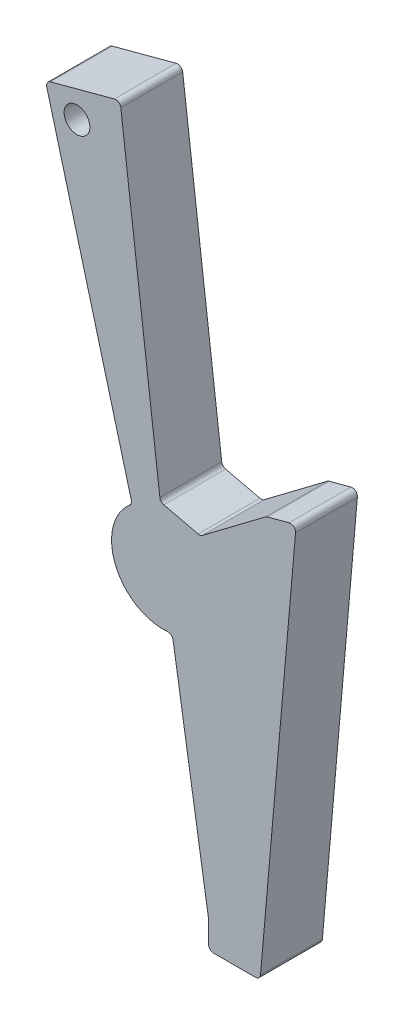
ISO-10303-21;
HEADER;
FILE_DESCRIPTION(('STEP AP214'),'2;1');
FILE_NAME('part.step','',(''),(''),'','','');
FILE_SCHEMA(('AUTOMOTIVE_DESIGN { 1 0 10303 214 1 1 1 1 }'));
ENDSEC;
DATA;
#1=APPLICATION_CONTEXT('core data for automotive mechanical design processes');
#2=APPLICATION_PROTOCOL_DEFINITION('international standard','automotive_design',2000,#1);
#3=PRODUCT_CONTEXT('',#1,'mechanical');
#4=PRODUCT('Part','Part','',(#3));
#5=PRODUCT_RELATED_PRODUCT_CATEGORY('part','',(#4));
#6=PRODUCT_DEFINITION_FORMATION('','',#4);
#7=PRODUCT_DEFINITION_CONTEXT('part definition',#1,'design');
#8=PRODUCT_DEFINITION('design','',#6,#7);
#9=PRODUCT_DEFINITION_SHAPE('','',#8);
#10=(LENGTH_UNIT() NAMED_UNIT(*) SI_UNIT(.MILLI.,.METRE.));
#11=(NAMED_UNIT(*) PLANE_ANGLE_UNIT() SI_UNIT($,.RADIAN.));
#12=(NAMED_UNIT(*) SI_UNIT($,.STERADIAN.) SOLID_ANGLE_UNIT());
#13=UNCERTAINTY_MEASURE_WITH_UNIT(LENGTH_MEASURE(1.E-05),#10,'distance_accuracy_value','');
#14=(GEOMETRIC_REPRESENTATION_CONTEXT(3) GLOBAL_UNCERTAINTY_ASSIGNED_CONTEXT((#13)) GLOBAL_UNIT_ASSIGNED_CONTEXT((#10,
#11,#12)) REPRESENTATION_CONTEXT('',''));
#15=CARTESIAN_POINT('',(0.,0.,0.));
#16=DIRECTION('',(0.,0.,1.));
#17=DIRECTION('',(1.,0.,0.));
#18=AXIS2_PLACEMENT_3D('',#15,#16,#17);
#19=CARTESIAN_POINT('',(0.,0.,12.));
#20=DIRECTION('',(-0.992546151641322,-0.121869343405145,0.));
#21=DIRECTION('',(0.121869343405145,-0.992546151641322,0.));
#22=AXIS2_PLACEMENT_3D('',#19,#20,#21);
#23=PLANE('',#22);
#24=DIRECTION('',(-0.121869343405145,0.992546151641322,0.));
#25=VECTOR('',#24,1.);
#26=CARTESIAN_POINT('',(0.,0.,0.));
#27=LINE('',#26,#25);
#28=CARTESIAN_POINT('',(7.71476826545728,-62.8317453654303,0.));
#29=VERTEX_POINT('',#28);
#30=CARTESIAN_POINT('',(0.140194642462046,-1.14179373555697,0.));
#31=VERTEX_POINT('',#30);
#32=EDGE_CURVE('E238',#29,#31,#27,.T.);
#33=ORIENTED_EDGE('',*,*,#32,.T.);
#34=DIRECTION('',(0.,0.,-1.));
#35=VECTOR('',#34,1.);
#36=CARTESIAN_POINT('',(0.140194642462046,-1.14179373555697,12.));
#37=LINE('',#36,#35);
#38=CARTESIAN_POINT('',(0.140194642462046,-1.14179373555697,12.));
#39=VERTEX_POINT('',#38);
#40=EDGE_CURVE('E363',#31,#39,#37,.F.);
#41=ORIENTED_EDGE('',*,*,#40,.T.);
#42=DIRECTION('',(-0.121869343405145,0.992546151641322,0.));
#43=VECTOR('',#42,1.);
#44=CARTESIAN_POINT('',(0.,0.,12.));
#45=LINE('',#44,#43);
#46=CARTESIAN_POINT('',(7.71476826545728,-62.8317453654303,12.));
#47=VERTEX_POINT('',#46);
#48=EDGE_CURVE('E278',#47,#39,#45,.T.);
#49=ORIENTED_EDGE('',*,*,#48,.F.);
#50=DIRECTION('',(0.,0.,-1.));
#51=VECTOR('',#50,1.);
#52=CARTESIAN_POINT('',(7.71476826545729,-62.8317453654303,0.));
#53=LINE('',#52,#51);
#54=EDGE_CURVE('E357',#47,#29,#53,.T.);
#55=ORIENTED_EDGE('',*,*,#54,.T.);
#56=EDGE_LOOP('',(#33,#41,#49,#55));
#57=FACE_BOUND('',#56,.T.);
#58=ADVANCED_FACE('F44',(#57),#23,.F.);
#59=CARTESIAN_POINT('',(0.,0.,12.));
#60=DIRECTION('',(0.258819045102515,-0.96592582628907,0.));
#61=DIRECTION('',(0.96592582628907,0.258819045102515,0.));
#62=AXIS2_PLACEMENT_3D('',#59,#60,#61);
#63=PLANE('',#62);
#64=DIRECTION('',(-0.96592582628907,-0.258819045102515,0.));
#65=VECTOR('',#64,1.);
#66=CARTESIAN_POINT('',(0.,0.,0.));
#67=LINE('',#66,#65);
#68=CARTESIAN_POINT('',(-1.11117055428179,-0.297737252673041,0.));
#69=VERTEX_POINT('',#68);
#70=CARTESIAN_POINT('',(-13.522961568047,-3.6234666314352,0.));
#71=VERTEX_POINT('',#70);
#72=EDGE_CURVE('E243',#69,#71,#67,.T.);
#73=ORIENTED_EDGE('',*,*,#72,.T.);
#74=DIRECTION('',(0.,0.,-1.));
#75=VECTOR('',#74,1.);
#76=CARTESIAN_POINT('',(-13.522961568047,-3.6234666314352,12.));
#77=LINE('',#76,#75);
#78=CARTESIAN_POINT('',(-13.522961568047,-3.6234666314352,12.));
#79=VERTEX_POINT('',#78);
#80=EDGE_CURVE('E353',#71,#79,#77,.F.);
#81=ORIENTED_EDGE('',*,*,#80,.T.);
#82=DIRECTION('',(-0.96592582628907,-0.258819045102515,0.));
#83=VECTOR('',#82,1.);
#84=CARTESIAN_POINT('',(0.,0.,12.));
#85=LINE('',#84,#83);
#86=CARTESIAN_POINT('',(-1.11117055428179,-0.297737252673041,12.));
#87=VERTEX_POINT('',#86);
#88=EDGE_CURVE('E417',#87,#79,#85,.T.);
#89=ORIENTED_EDGE('',*,*,#88,.F.);
#90=DIRECTION('',(0.,0.,-1.));
#91=VECTOR('',#90,1.);
#92=CARTESIAN_POINT('',(-1.11117055428179,-0.297737252673041,12.));
#93=LINE('',#92,#91);
#94=EDGE_CURVE('E348',#87,#69,#93,.T.);
#95=ORIENTED_EDGE('',*,*,#94,.T.);
#96=EDGE_LOOP('',(#73,#81,#89,#95));
#97=FACE_BOUND('',#96,.T.);
#98=ADVANCED_FACE('F484',(#97),#63,.F.);
#99=CARTESIAN_POINT('',(-14.488887394336,-3.88228567653772,12.));
#100=DIRECTION('',(0.96592582628907,0.258819045102515,0.));
#101=DIRECTION('',(-0.258819045102515,0.96592582628907,0.));
#102=AXIS2_PLACEMENT_3D('',#99,#100,#101);
#103=PLANE('',#102);
#104=DIRECTION('',(0.258819045102515,-0.96592582628907,0.));
#105=VECTOR('',#104,1.);
#106=CARTESIAN_POINT('',(-14.488887394336,-3.88228567653772,0.));
#107=LINE('',#106,#105);
#108=CARTESIAN_POINT('',(-14.2300683492335,-4.84821150282679,0.));
#109=VERTEX_POINT('',#108);
#110=CARTESIAN_POINT('',(2.16544616228649,-66.0371046760539,0.));
#111=VERTEX_POINT('',#110);
#112=EDGE_CURVE('E248',#109,#111,#107,.T.);
#113=ORIENTED_EDGE('',*,*,#112,.T.);
#114=DIRECTION('',(0.,0.,1.));
#115=VECTOR('',#114,1.);
#116=CARTESIAN_POINT('',(2.16544616228649,-66.0371046760539,12.));
#117=LINE('',#116,#115);
#118=CARTESIAN_POINT('',(2.16544616228649,-66.0371046760539,12.));
#119=VERTEX_POINT('',#118);
#120=EDGE_CURVE('E295',#111,#119,#117,.T.);
#121=ORIENTED_EDGE('',*,*,#120,.T.);
#122=DIRECTION('',(0.258819045102515,-0.96592582628907,0.));
#123=VECTOR('',#122,1.);
#124=CARTESIAN_POINT('',(-14.488887394336,-3.88228567653772,12.));
#125=LINE('',#124,#123);
#126=CARTESIAN_POINT('',(-14.2300683492335,-4.84821150282679,12.));
#127=VERTEX_POINT('',#126);
#128=EDGE_CURVE('E423',#127,#119,#125,.T.);
#129=ORIENTED_EDGE('',*,*,#128,.F.);
#130=DIRECTION('',(0.,0.,-1.));
#131=VECTOR('',#130,1.);
#132=CARTESIAN_POINT('',(-14.2300683492335,-4.84821150282679,12.));
#133=LINE('',#132,#131);
#134=EDGE_CURVE('E289',#127,#109,#133,.T.);
#135=ORIENTED_EDGE('',*,*,#134,.T.);
#136=EDGE_LOOP('',(#113,#121,#129,#135));
#137=FACE_BOUND('',#136,.T.);
#138=ADVANCED_FACE('F491',(#137),#103,.F.);
#139=CARTESIAN_POINT('',(8.34107123698053,-74.6624194468869,12.));
#140=DIRECTION('',(0.,0.,-1.));
#141=DIRECTION('',(-1.,0.,0.));
#142=AXIS2_PLACEMENT_3D('',#139,#140,#141);
#143=CYLINDRICAL_SURFACE('',#142,10.);
#144=CARTESIAN_POINT('',(8.34107123698053,-74.6624194468869,12.));
#145=DIRECTION('',(0.,0.,1.));
#146=DIRECTION('',(-1.,0.,0.));
#147=AXIS2_PLACEMENT_3D('',#144,#145,#146);
#148=CIRCLE('',#147,10.);
#149=CARTESIAN_POINT('',(1.8487522360868,-67.0565142416773,12.));
#150=VERTEX_POINT('',#149);
#151=CARTESIAN_POINT('',(9.19930238082329,-84.6255233459606,12.));
#152=VERTEX_POINT('',#151);
#153=EDGE_CURVE('E205',#150,#152,#148,.T.);
#154=ORIENTED_EDGE('',*,*,#153,.F.);
#155=DIRECTION('',(0.,0.,-1.));
#156=VECTOR('',#155,1.);
#157=CARTESIAN_POINT('',(1.8487522360868,-67.0565142416773,12.));
#158=LINE('',#157,#156);
#159=CARTESIAN_POINT('',(1.8487522360868,-67.0565142416773,0.));
#160=VERTEX_POINT('',#159);
#161=EDGE_CURVE('E283',#150,#160,#158,.T.);
#162=ORIENTED_EDGE('',*,*,#161,.T.);
#163=CARTESIAN_POINT('',(8.34107123698053,-74.6624194468869,0.));
#164=DIRECTION('',(0.,0.,1.));
#165=DIRECTION('',(-1.,0.,0.));
#166=AXIS2_PLACEMENT_3D('',#163,#164,#165);
#167=CIRCLE('',#166,10.);
#168=CARTESIAN_POINT('',(9.19930238082329,-84.6255233459606,0.));
#169=VERTEX_POINT('',#168);
#170=EDGE_CURVE('E251',#160,#169,#167,.T.);
#171=ORIENTED_EDGE('',*,*,#170,.T.);
#172=DIRECTION('',(0.,0.,-1.));
#173=VECTOR('',#172,1.);
#174=CARTESIAN_POINT('',(9.19930238082329,-84.6255233459606,12.));
#175=LINE('',#174,#173);
#176=EDGE_CURVE('E213',#169,#152,#175,.F.);
#177=ORIENTED_EDGE('',*,*,#176,.T.);
#178=EDGE_LOOP('',(#154,#162,#171,#177));
#179=FACE_BOUND('',#178,.T.);
#180=ADVANCED_FACE('F518',(#179),#143,.T.);
#181=CARTESIAN_POINT('',(17.1599123609778,-128.948828015868,12.));
#182=DIRECTION('',(0.987688340595138,0.156434465040231,0.));
#183=DIRECTION('',(-0.156434465040231,0.987688340595138,0.));
#184=AXIS2_PLACEMENT_3D('',#181,#182,#183);
#185=PLANE('',#184);
#186=DIRECTION('',(0.156434465040231,-0.987688340595138,0.));
#187=VECTOR('',#186,1.);
#188=CARTESIAN_POINT('',(17.1599123609778,-128.948828015868,12.));
#189=LINE('',#188,#187);
#190=CARTESIAN_POINT('',(10.2728138358027,-85.4653992708278,12.));
#191=VERTEX_POINT('',#190);
#192=CARTESIAN_POINT('',(17.1599123609778,-128.948828015868,12.));
#193=VERTEX_POINT('',#192);
#194=EDGE_CURVE('E188',#191,#193,#189,.T.);
#195=ORIENTED_EDGE('',*,*,#194,.F.);
#196=DIRECTION('',(0.,0.,1.));
#197=VECTOR('',#196,1.);
#198=CARTESIAN_POINT('',(10.2728138358027,-85.4653992708278,0.));
#199=LINE('',#198,#197);
#200=CARTESIAN_POINT('',(10.2728138358027,-85.4653992708278,0.));
#201=VERTEX_POINT('',#200);
#202=EDGE_CURVE('E293',#191,#201,#199,.F.);
#203=ORIENTED_EDGE('',*,*,#202,.T.);
#204=DIRECTION('',(0.156434465040231,-0.987688340595138,0.));
#205=VECTOR('',#204,1.);
#206=CARTESIAN_POINT('',(17.1599123609778,-128.948828015868,0.));
#207=LINE('',#206,#205);
#208=CARTESIAN_POINT('',(17.1599123609778,-128.948828015868,0.));
#209=VERTEX_POINT('',#208);
#210=EDGE_CURVE('E208',#201,#209,#207,.T.);
#211=ORIENTED_EDGE('',*,*,#210,.T.);
#212=DIRECTION('',(0.,0.,-1.));
#213=VECTOR('',#212,1.);
#214=CARTESIAN_POINT('',(17.1599123609778,-128.948828015868,12.));
#215=LINE('',#214,#213);
#216=EDGE_CURVE('E202',#193,#209,#215,.T.);
#217=ORIENTED_EDGE('',*,*,#216,.F.);
#218=EDGE_LOOP('',(#195,#203,#211,#217));
#219=FACE_BOUND('',#218,.T.);
#220=ADVANCED_FACE('F206',(#219),#185,.F.);
#221=CARTESIAN_POINT('',(17.1599123609778,-134.180494132697,12.));
#222=DIRECTION('',(1.,0.,0.));
#223=DIRECTION('',(0.,1.,0.));
#224=AXIS2_PLACEMENT_3D('',#221,#222,#223);
#225=PLANE('',#224);
#226=DIRECTION('',(0.,-1.,0.));
#227=VECTOR('',#226,1.);
#228=CARTESIAN_POINT('',(17.1599123609778,-134.180494132697,0.));
#229=LINE('',#228,#227);
#230=CARTESIAN_POINT('',(17.1599123609778,-133.180494132697,0.));
#231=VERTEX_POINT('',#230);
#232=EDGE_CURVE('E259',#209,#231,#229,.T.);
#233=ORIENTED_EDGE('',*,*,#232,.T.);
#234=DIRECTION('',(0.,0.,-1.));
#235=VECTOR('',#234,1.);
#236=CARTESIAN_POINT('',(17.1599123609778,-133.180494132697,12.));
#237=LINE('',#236,#235);
#238=CARTESIAN_POINT('',(17.1599123609778,-133.180494132697,12.));
#239=VERTEX_POINT('',#238);
#240=EDGE_CURVE('E217',#231,#239,#237,.F.);
#241=ORIENTED_EDGE('',*,*,#240,.T.);
#242=DIRECTION('',(0.,-1.,0.));
#243=VECTOR('',#242,1.);
#244=CARTESIAN_POINT('',(17.1599123609778,-134.180494132697,12.));
#245=LINE('',#244,#243);
#246=EDGE_CURVE('E194',#193,#239,#245,.T.);
#247=ORIENTED_EDGE('',*,*,#246,.F.);
#248=ORIENTED_EDGE('',*,*,#216,.T.);
#249=EDGE_LOOP('',(#233,#241,#247,#248));
#250=FACE_BOUND('',#249,.T.);
#251=ADVANCED_FACE('F216',(#250),#225,.F.);
#252=CARTESIAN_POINT('',(27.1599123609778,-134.180494132697,12.));
#253=DIRECTION('',(0.,1.,0.));
#254=DIRECTION('',(-1.,0.,0.));
#255=AXIS2_PLACEMENT_3D('',#252,#253,#254);
#256=PLANE('',#255);
#257=DIRECTION('',(1.,0.,0.));
#258=VECTOR('',#257,1.);
#259=CARTESIAN_POINT('',(27.1599123609778,-134.180494132697,12.));
#260=LINE('',#259,#258);
#261=CARTESIAN_POINT('',(18.1599123609778,-134.180494132697,12.));
#262=VERTEX_POINT('',#261);
#263=CARTESIAN_POINT('',(26.2435811869604,-134.180494132697,12.));
#264=VERTEX_POINT('',#263);
#265=EDGE_CURVE('E219',#262,#264,#260,.T.);
#266=ORIENTED_EDGE('',*,*,#265,.F.);
#267=DIRECTION('',(0.,0.,-1.));
#268=VECTOR('',#267,1.);
#269=CARTESIAN_POINT('',(18.1599123609778,-134.180494132697,12.));
#270=LINE('',#269,#268);
#271=CARTESIAN_POINT('',(18.1599123609778,-134.180494132697,0.));
#272=VERTEX_POINT('',#271);
#273=EDGE_CURVE('E301',#262,#272,#270,.T.);
#274=ORIENTED_EDGE('',*,*,#273,.T.);
#275=DIRECTION('',(1.,0.,0.));
#276=VECTOR('',#275,1.);
#277=CARTESIAN_POINT('',(27.1599123609778,-134.180494132697,0.));
#278=LINE('',#277,#276);
#279=CARTESIAN_POINT('',(26.2435811869604,-134.180494132697,0.));
#280=VERTEX_POINT('',#279);
#281=EDGE_CURVE('E265',#272,#280,#278,.T.);
#282=ORIENTED_EDGE('',*,*,#281,.T.);
#283=DIRECTION('',(0.,0.,-1.));
#284=VECTOR('',#283,1.);
#285=CARTESIAN_POINT('',(26.2435811869604,-134.180494132697,12.));
#286=LINE('',#285,#284);
#287=EDGE_CURVE('E297',#280,#264,#286,.F.);
#288=ORIENTED_EDGE('',*,*,#287,.T.);
#289=EDGE_LOOP('',(#266,#274,#282,#288));
#290=FACE_BOUND('',#289,.T.);
#291=ADVANCED_FACE('F441',(#290),#256,.F.);
#292=CARTESIAN_POINT('',(34.1590054430514,-54.1804941326969,12.));
#293=DIRECTION('',(-0.996194698091746,0.0871557427476542,0.));
#294=DIRECTION('',(-0.0871557427476542,-0.996194698091746,0.));
#295=AXIS2_PLACEMENT_3D('',#292,#293,#294);
#296=PLANE('',#295);
#297=DIRECTION('',(0.0871557427476542,0.996194698091746,0.));
#298=VECTOR('',#297,1.);
#299=CARTESIAN_POINT('',(34.1590054430514,-54.1804941326969,12.));
#300=LINE('',#299,#298);
#301=CARTESIAN_POINT('',(27.2397758850521,-133.267649875445,12.));
#302=VERTEX_POINT('',#301);
#303=CARTESIAN_POINT('',(34.0345341427702,-55.6032076051037,12.));
#304=VERTEX_POINT('',#303);
#305=EDGE_CURVE('E221',#302,#304,#300,.T.);
#306=ORIENTED_EDGE('',*,*,#305,.F.);
#307=DIRECTION('',(0.,0.,-1.));
#308=VECTOR('',#307,1.);
#309=CARTESIAN_POINT('',(27.2397758850521,-133.267649875445,12.));
#310=LINE('',#309,#308);
#311=CARTESIAN_POINT('',(27.2397758850521,-133.267649875445,0.));
#312=VERTEX_POINT('',#311);
#313=EDGE_CURVE('E347',#302,#312,#310,.T.);
#314=ORIENTED_EDGE('',*,*,#313,.T.);
#315=DIRECTION('',(0.0871557427476542,0.996194698091746,0.));
#316=VECTOR('',#315,1.);
#317=CARTESIAN_POINT('',(34.1590054430514,-54.1804941326969,0.));
#318=LINE('',#317,#316);
#319=CARTESIAN_POINT('',(34.0345341427702,-55.6032076051037,0.));
#320=VERTEX_POINT('',#319);
#321=EDGE_CURVE('E266',#312,#320,#318,.T.);
#322=ORIENTED_EDGE('',*,*,#321,.T.);
#323=DIRECTION('',(0.,0.,-1.));
#324=VECTOR('',#323,1.);
#325=CARTESIAN_POINT('',(34.0345341427702,-55.6032076051037,12.));
#326=LINE('',#325,#324);
#327=EDGE_CURVE('E344',#320,#304,#326,.F.);
#328=ORIENTED_EDGE('',*,*,#327,.T.);
#329=EDGE_LOOP('',(#306,#314,#322,#328));
#330=FACE_BOUND('',#329,.T.);
#331=ADVANCED_FACE('F452',(#330),#296,.F.);
#332=CARTESIAN_POINT('',(28.363450485317,-55.733408403312,12.));
#333=DIRECTION('',(0.258819045102515,-0.96592582628907,0.));
#334=DIRECTION('',(0.96592582628907,0.258819045102515,0.));
#335=AXIS2_PLACEMENT_3D('',#332,#333,#334);
#336=PLANE('',#335);
#337=DIRECTION('',(-0.96592582628907,-0.258819045102515,0.));
#338=VECTOR('',#337,1.);
#339=CARTESIAN_POINT('',(28.363450485317,-55.733408403312,0.));
#340=LINE('',#339,#338);
#341=CARTESIAN_POINT('',(32.7795203995759,-54.5501260360669,0.));
#342=VERTEX_POINT('',#341);
#343=CARTESIAN_POINT('',(28.5512074460351,-55.6830990773142,0.));
#344=VERTEX_POINT('',#343);
#345=EDGE_CURVE('E269',#342,#344,#340,.T.);
#346=ORIENTED_EDGE('',*,*,#345,.T.);
#347=DIRECTION('',(0.,0.,-1.));
#348=VECTOR('',#347,1.);
#349=CARTESIAN_POINT('',(28.5512074460351,-55.6830990773142,12.));
#350=LINE('',#349,#348);
#351=CARTESIAN_POINT('',(28.5512074460351,-55.6830990773142,12.));
#352=VERTEX_POINT('',#351);
#353=EDGE_CURVE('E381',#344,#352,#350,.F.);
#354=ORIENTED_EDGE('',*,*,#353,.T.);
#355=DIRECTION('',(-0.96592582628907,-0.258819045102515,0.));
#356=VECTOR('',#355,1.);
#357=CARTESIAN_POINT('',(28.363450485317,-55.733408403312,12.));
#358=LINE('',#357,#356);
#359=CARTESIAN_POINT('',(32.7795203995759,-54.5501260360669,12.));
#360=VERTEX_POINT('',#359);
#361=EDGE_CURVE('E231',#360,#352,#358,.T.);
#362=ORIENTED_EDGE('',*,*,#361,.F.);
#363=DIRECTION('',(0.,0.,-1.));
#364=VECTOR('',#363,1.);
#365=CARTESIAN_POINT('',(32.7795203995759,-54.5501260360669,12.));
#366=LINE('',#365,#364);
#367=EDGE_CURVE('E380',#360,#342,#366,.T.);
#368=ORIENTED_EDGE('',*,*,#367,.T.);
#369=EDGE_LOOP('',(#346,#354,#362,#368));
#370=FACE_BOUND('',#369,.T.);
#371=ADVANCED_FACE('F458',(#370),#336,.F.);
#372=CARTESIAN_POINT('',(15.5852823245603,-65.3624487737448,12.));
#373=DIRECTION('',(0.601815023152049,-0.798635510047292,0.));
#374=DIRECTION('',(0.798635510047292,0.601815023152049,0.));
#375=AXIS2_PLACEMENT_3D('',#372,#373,#374);
#376=PLANE('',#375);
#377=DIRECTION('',(-0.798635510047292,-0.601815023152049,0.));
#378=VECTOR('',#377,1.);
#379=CARTESIAN_POINT('',(15.5852823245603,-65.3624487737448,0.));
#380=LINE('',#379,#378);
#381=CARTESIAN_POINT('',(28.2082114679856,-55.850389393556,0.));
#382=VERTEX_POINT('',#381);
#383=CARTESIAN_POINT('',(15.9601842419789,-65.0799399154827,0.));
#384=VERTEX_POINT('',#383);
#385=EDGE_CURVE('E273',#382,#384,#380,.T.);
#386=ORIENTED_EDGE('',*,*,#385,.T.);
#387=DIRECTION('',(0.,0.,-1.));
#388=VECTOR('',#387,1.);
#389=CARTESIAN_POINT('',(15.9601842419789,-65.0799399154827,12.));
#390=LINE('',#389,#388);
#391=CARTESIAN_POINT('',(15.9601842419789,-65.0799399154827,12.));
#392=VERTEX_POINT('',#391);
#393=EDGE_CURVE('E372',#384,#392,#390,.F.);
#394=ORIENTED_EDGE('',*,*,#393,.T.);
#395=DIRECTION('',(-0.798635510047292,-0.601815023152049,0.));
#396=VECTOR('',#395,1.);
#397=CARTESIAN_POINT('',(15.5852823245603,-65.3624487737448,12.));
#398=LINE('',#397,#396);
#399=CARTESIAN_POINT('',(28.2082114679856,-55.850389393556,12.));
#400=VERTEX_POINT('',#399);
#401=EDGE_CURVE('E235',#400,#392,#398,.T.);
#402=ORIENTED_EDGE('',*,*,#401,.F.);
#403=DIRECTION('',(0.,0.,-1.));
#404=VECTOR('',#403,1.);
#405=CARTESIAN_POINT('',(28.2082114679856,-55.850389393556,12.));
#406=LINE('',#405,#404);
#407=EDGE_CURVE('E367',#400,#382,#406,.T.);
#408=ORIENTED_EDGE('',*,*,#407,.T.);
#409=EDGE_LOOP('',(#386,#394,#402,#408));
#410=FACE_BOUND('',#409,.T.);
#411=ADVANCED_FACE('F469',(#410),#376,.F.);
#412=CARTESIAN_POINT('',(7.79963797792926,-63.5229537050446,12.));
#413=DIRECTION('',(-0.22993688358752,-0.973205543328879,0.));
#414=DIRECTION('',(0.973205543328879,-0.22993688358752,0.));
#415=AXIS2_PLACEMENT_3D('',#412,#413,#414);
#416=PLANE('',#415);
#417=DIRECTION('',(-0.973205543328879,0.22993688358752,0.));
#418=VECTOR('',#417,1.);
#419=CARTESIAN_POINT('',(7.79963797792926,-63.5229537050446,12.));
#420=LINE('',#419,#418);
#421=CARTESIAN_POINT('',(15.1284323352393,-65.2545099487643,12.));
#422=VERTEX_POINT('',#421);
#423=CARTESIAN_POINT('',(8.47737753351109,-63.683081565354,12.));
#424=VERTEX_POINT('',#423);
#425=EDGE_CURVE('E212',#422,#424,#420,.T.);
#426=ORIENTED_EDGE('',*,*,#425,.F.);
#427=DIRECTION('',(0.,0.,-1.));
#428=VECTOR('',#427,1.);
#429=CARTESIAN_POINT('',(15.1284323352393,-65.2545099487643,0.));
#430=LINE('',#429,#428);
#431=CARTESIAN_POINT('',(15.1284323352393,-65.2545099487643,0.));
#432=VERTEX_POINT('',#431);
#433=EDGE_CURVE('E368',#422,#432,#430,.T.);
#434=ORIENTED_EDGE('',*,*,#433,.T.);
#435=DIRECTION('',(-0.973205543328879,0.22993688358752,0.));
#436=VECTOR('',#435,1.);
#437=CARTESIAN_POINT('',(7.79963797792926,-63.5229537050446,0.));
#438=LINE('',#437,#436);
#439=CARTESIAN_POINT('',(8.47737753351109,-63.683081565354,0.));
#440=VERTEX_POINT('',#439);
#441=EDGE_CURVE('E279',#432,#440,#438,.T.);
#442=ORIENTED_EDGE('',*,*,#441,.T.);
#443=DIRECTION('',(0.,0.,-1.));
#444=VECTOR('',#443,1.);
#445=CARTESIAN_POINT('',(8.47737753351109,-63.683081565354,12.));
#446=LINE('',#445,#444);
#447=EDGE_CURVE('E61',#440,#424,#446,.F.);
#448=ORIENTED_EDGE('',*,*,#447,.T.);
#449=EDGE_LOOP('',(#426,#434,#442,#448));
#450=FACE_BOUND('',#449,.T.);
#451=ADVANCED_FACE('F410',(#450),#416,.F.);
#452=CARTESIAN_POINT('',(8.34107123698053,-74.6624194468869,12.));
#453=DIRECTION('',(0.,0.,-1.));
#454=DIRECTION('',(-1.,0.,0.));
#455=AXIS2_PLACEMENT_3D('',#452,#453,#454);
#456=PLANE('',#455);
#457=CARTESIAN_POINT('',(-8.36516303737812,-7.4178195824705,12.));
#458=DIRECTION('',(0.,0.,1.));
#459=DIRECTION('',(1.,0.,0.));
#460=AXIS2_PLACEMENT_3D('',#457,#458,#459);
#461=CIRCLE('',#460,2.5);
#462=CARTESIAN_POINT('',(-5.86516303737812,-7.4178195824705,12.));
#463=VERTEX_POINT('',#462);
#464=EDGE_CURVE('E424',#463,#463,#461,.T.);
#465=ORIENTED_EDGE('',*,*,#464,.F.);
#466=EDGE_LOOP('',(#465));
#467=FACE_BOUND('',#466,.T.);
#468=ORIENTED_EDGE('',*,*,#246,.T.);
#469=CARTESIAN_POINT('',(18.1599123609778,-133.180494132697,12.));
#470=DIRECTION('',(0.,0.,-1.));
#471=DIRECTION('',(-1.,0.,0.));
#472=AXIS2_PLACEMENT_3D('',#469,#470,#471);
#473=CIRCLE('',#472,1.);
#474=EDGE_CURVE('E339',#239,#262,#473,.F.);
#475=ORIENTED_EDGE('',*,*,#474,.T.);
#476=ORIENTED_EDGE('',*,*,#265,.T.);
#477=CARTESIAN_POINT('',(26.2435811869604,-133.180494132697,12.));
#478=DIRECTION('',(0.,0.,-1.));
#479=DIRECTION('',(-1.,0.,0.));
#480=AXIS2_PLACEMENT_3D('',#477,#478,#479);
#481=CIRCLE('',#480,1.);
#482=EDGE_CURVE('E340',#264,#302,#481,.F.);
#483=ORIENTED_EDGE('',*,*,#482,.T.);
#484=ORIENTED_EDGE('',*,*,#305,.T.);
#485=CARTESIAN_POINT('',(33.0383394446784,-55.516051862356,12.));
#486=DIRECTION('',(0.,0.,-1.));
#487=DIRECTION('',(-1.,0.,0.));
#488=AXIS2_PLACEMENT_3D('',#485,#486,#487);
#489=CIRCLE('',#488,1.);
#490=EDGE_CURVE('E324',#304,#360,#489,.F.);
#491=ORIENTED_EDGE('',*,*,#490,.T.);
#492=ORIENTED_EDGE('',*,*,#361,.T.);
#493=CARTESIAN_POINT('',(28.8100264911376,-56.6490249036033,12.));
#494=DIRECTION('',(0.,0.,-1.));
#495=DIRECTION('',(-1.,0.,0.));
#496=AXIS2_PLACEMENT_3D('',#493,#494,#495);
#497=CIRCLE('',#496,1.);
#498=EDGE_CURVE('E327',#352,#400,#497,.F.);
#499=ORIENTED_EDGE('',*,*,#498,.T.);
#500=ORIENTED_EDGE('',*,*,#401,.T.);
#501=CARTESIAN_POINT('',(15.3583692188268,-64.2813044054354,12.));
#502=DIRECTION('',(0.,0.,-1.));
#503=DIRECTION('',(-1.,0.,0.));
#504=AXIS2_PLACEMENT_3D('',#501,#502,#503);
#505=CIRCLE('',#504,1.);
#506=EDGE_CURVE('E69',#392,#422,#505,.T.);
#507=ORIENTED_EDGE('',*,*,#506,.T.);
#508=ORIENTED_EDGE('',*,*,#425,.T.);
#509=CARTESIAN_POINT('',(8.70731441709861,-62.7098760220251,12.));
#510=DIRECTION('',(0.,0.,-1.));
#511=DIRECTION('',(-1.,0.,0.));
#512=AXIS2_PLACEMENT_3D('',#509,#510,#511);
#513=CIRCLE('',#512,1.);
#514=EDGE_CURVE('E11',#424,#47,#513,.T.);
#515=ORIENTED_EDGE('',*,*,#514,.T.);
#516=ORIENTED_EDGE('',*,*,#48,.T.);
#517=CARTESIAN_POINT('',(-0.852351509179276,-1.26366307896211,12.));
#518=DIRECTION('',(0.,0.,-1.));
#519=DIRECTION('',(-1.,0.,0.));
#520=AXIS2_PLACEMENT_3D('',#517,#518,#519);
#521=CIRCLE('',#520,1.);
#522=EDGE_CURVE('E332',#39,#87,#521,.F.);
#523=ORIENTED_EDGE('',*,*,#522,.T.);
#524=ORIENTED_EDGE('',*,*,#88,.T.);
#525=CARTESIAN_POINT('',(-13.2641425229445,-4.58939245772427,12.));
#526=DIRECTION('',(0.,0.,-1.));
#527=DIRECTION('',(-1.,0.,0.));
#528=AXIS2_PLACEMENT_3D('',#525,#526,#527);
#529=CIRCLE('',#528,1.);
#530=EDGE_CURVE('E331',#79,#127,#529,.F.);
#531=ORIENTED_EDGE('',*,*,#530,.T.);
#532=ORIENTED_EDGE('',*,*,#128,.T.);
#533=CARTESIAN_POINT('',(1.19952033599742,-66.2959237211564,12.));
#534=DIRECTION('',(0.,0.,-1.));
#535=DIRECTION('',(-1.,0.,0.));
#536=AXIS2_PLACEMENT_3D('',#533,#534,#535);
#537=CIRCLE('',#536,1.);
#538=EDGE_CURVE('E390',#119,#150,#537,.T.);
#539=ORIENTED_EDGE('',*,*,#538,.T.);
#540=ORIENTED_EDGE('',*,*,#153,.T.);
#541=CARTESIAN_POINT('',(9.28512549520757,-85.621833735868,12.));
#542=DIRECTION('',(0.,0.,-1.));
#543=DIRECTION('',(-1.,0.,0.));
#544=AXIS2_PLACEMENT_3D('',#541,#542,#543);
#545=CIRCLE('',#544,1.);
#546=EDGE_CURVE('E197',#152,#191,#545,.T.);
#547=ORIENTED_EDGE('',*,*,#546,.T.);
#548=ORIENTED_EDGE('',*,*,#194,.T.);
#549=EDGE_LOOP('',(#468,#475,#476,#483,#484,#491,#492,#499,#500,#507,#508,#515,#516,#523,#524,
#531,#532,#539,#540,#547,#548));
#550=FACE_BOUND('',#549,.T.);
#551=ADVANCED_FACE('F191',(#467,#550),#456,.F.);
#552=CARTESIAN_POINT('',(8.34107123698053,-74.6624194468869,0.));
#553=DIRECTION('',(0.,0.,-1.));
#554=DIRECTION('',(-1.,0.,0.));
#555=AXIS2_PLACEMENT_3D('',#552,#553,#554);
#556=PLANE('',#555);
#557=CARTESIAN_POINT('',(-8.36516303737812,-7.4178195824705,0.));
#558=DIRECTION('',(0.,0.,1.));
#559=DIRECTION('',(1.,0.,0.));
#560=AXIS2_PLACEMENT_3D('',#557,#558,#559);
#561=CIRCLE('',#560,2.5);
#562=CARTESIAN_POINT('',(-5.86516303737812,-7.4178195824705,0.));
#563=VERTEX_POINT('',#562);
#564=EDGE_CURVE('E244',#563,#563,#561,.T.);
#565=ORIENTED_EDGE('',*,*,#564,.T.);
#566=EDGE_LOOP('',(#565));
#567=FACE_BOUND('',#566,.T.);
#568=ORIENTED_EDGE('',*,*,#281,.F.);
#569=CARTESIAN_POINT('',(18.1599123609778,-133.180494132697,0.));
#570=DIRECTION('',(0.,0.,-1.));
#571=DIRECTION('',(-1.,0.,0.));
#572=AXIS2_PLACEMENT_3D('',#569,#570,#571);
#573=CIRCLE('',#572,1.);
#574=EDGE_CURVE('E319',#272,#231,#573,.T.);
#575=ORIENTED_EDGE('',*,*,#574,.T.);
#576=ORIENTED_EDGE('',*,*,#232,.F.);
#577=ORIENTED_EDGE('',*,*,#210,.F.);
#578=CARTESIAN_POINT('',(9.28512549520757,-85.621833735868,0.));
#579=DIRECTION('',(0.,0.,-1.));
#580=DIRECTION('',(-1.,0.,0.));
#581=AXIS2_PLACEMENT_3D('',#578,#579,#580);
#582=CIRCLE('',#581,1.);
#583=EDGE_CURVE('E388',#201,#169,#582,.F.);
#584=ORIENTED_EDGE('',*,*,#583,.T.);
#585=ORIENTED_EDGE('',*,*,#170,.F.);
#586=CARTESIAN_POINT('',(1.19952033599742,-66.2959237211564,0.));
#587=DIRECTION('',(0.,0.,-1.));
#588=DIRECTION('',(-1.,0.,0.));
#589=AXIS2_PLACEMENT_3D('',#586,#587,#588);
#590=CIRCLE('',#589,1.);
#591=EDGE_CURVE('E383',#160,#111,#590,.F.);
#592=ORIENTED_EDGE('',*,*,#591,.T.);
#593=ORIENTED_EDGE('',*,*,#112,.F.);
#594=CARTESIAN_POINT('',(-13.2641425229445,-4.58939245772427,0.));
#595=DIRECTION('',(0.,0.,-1.));
#596=DIRECTION('',(-1.,0.,0.));
#597=AXIS2_PLACEMENT_3D('',#594,#595,#596);
#598=CIRCLE('',#597,1.);
#599=EDGE_CURVE('E314',#109,#71,#598,.T.);
#600=ORIENTED_EDGE('',*,*,#599,.T.);
#601=ORIENTED_EDGE('',*,*,#72,.F.);
#602=CARTESIAN_POINT('',(-0.852351509179276,-1.26366307896211,0.));
#603=DIRECTION('',(0.,0.,-1.));
#604=DIRECTION('',(-1.,0.,0.));
#605=AXIS2_PLACEMENT_3D('',#602,#603,#604);
#606=CIRCLE('',#605,1.);
#607=EDGE_CURVE('E313',#69,#31,#606,.T.);
#608=ORIENTED_EDGE('',*,*,#607,.T.);
#609=ORIENTED_EDGE('',*,*,#32,.F.);
#610=CARTESIAN_POINT('',(8.70731441709861,-62.7098760220251,0.));
#611=DIRECTION('',(0.,0.,-1.));
#612=DIRECTION('',(-1.,0.,0.));
#613=AXIS2_PLACEMENT_3D('',#610,#611,#612);
#614=CIRCLE('',#613,1.);
#615=EDGE_CURVE('E53',#29,#440,#614,.F.);
#616=ORIENTED_EDGE('',*,*,#615,.T.);
#617=ORIENTED_EDGE('',*,*,#441,.F.);
#618=CARTESIAN_POINT('',(15.3583692188268,-64.2813044054354,0.));
#619=DIRECTION('',(0.,0.,-1.));
#620=DIRECTION('',(-1.,0.,0.));
#621=AXIS2_PLACEMENT_3D('',#618,#619,#620);
#622=CIRCLE('',#621,1.);
#623=EDGE_CURVE('E394',#432,#384,#622,.F.);
#624=ORIENTED_EDGE('',*,*,#623,.T.);
#625=ORIENTED_EDGE('',*,*,#385,.F.);
#626=CARTESIAN_POINT('',(28.8100264911376,-56.6490249036033,0.));
#627=DIRECTION('',(0.,0.,-1.));
#628=DIRECTION('',(-1.,0.,0.));
#629=AXIS2_PLACEMENT_3D('',#626,#627,#628);
#630=CIRCLE('',#629,1.);
#631=EDGE_CURVE('E306',#382,#344,#630,.T.);
#632=ORIENTED_EDGE('',*,*,#631,.T.);
#633=ORIENTED_EDGE('',*,*,#345,.F.);
#634=CARTESIAN_POINT('',(33.0383394446784,-55.516051862356,0.));
#635=DIRECTION('',(0.,0.,-1.));
#636=DIRECTION('',(-1.,0.,0.));
#637=AXIS2_PLACEMENT_3D('',#634,#635,#636);
#638=CIRCLE('',#637,1.);
#639=EDGE_CURVE('E305',#342,#320,#638,.T.);
#640=ORIENTED_EDGE('',*,*,#639,.T.);
#641=ORIENTED_EDGE('',*,*,#321,.F.);
#642=CARTESIAN_POINT('',(26.2435811869604,-133.180494132697,0.));
#643=DIRECTION('',(0.,0.,-1.));
#644=DIRECTION('',(-1.,0.,0.));
#645=AXIS2_PLACEMENT_3D('',#642,#643,#644);
#646=CIRCLE('',#645,1.);
#647=EDGE_CURVE('E320',#312,#280,#646,.T.);
#648=ORIENTED_EDGE('',*,*,#647,.T.);
#649=EDGE_LOOP('',(#568,#575,#576,#577,#584,#585,#592,#593,#600,#601,#608,#609,#616,#617,#624,
#625,#632,#633,#640,#641,#648));
#650=FACE_BOUND('',#649,.T.);
#651=ADVANCED_FACE('F404',(#567,#650),#556,.T.);
#652=CARTESIAN_POINT('',(-8.36516303737812,-7.4178195824705,0.));
#653=DIRECTION('',(0.,0.,1.));
#654=DIRECTION('',(1.,0.,0.));
#655=AXIS2_PLACEMENT_3D('',#652,#653,#654);
#656=CYLINDRICAL_SURFACE('',#655,2.5);
#657=ORIENTED_EDGE('',*,*,#564,.F.);
#658=EDGE_LOOP('',(#657));
#659=FACE_BOUND('',#658,.T.);
#660=ORIENTED_EDGE('',*,*,#464,.T.);
#661=EDGE_LOOP('',(#660));
#662=FACE_BOUND('',#661,.T.);
#663=ADVANCED_FACE('F496',(#659,#662),#656,.F.);
#664=CARTESIAN_POINT('',(1.19952033599742,-66.2959237211564,12.));
#665=DIRECTION('',(0.,0.,-1.));
#666=DIRECTION('',(-1.,0.,0.));
#667=AXIS2_PLACEMENT_3D('',#664,#665,#666);
#668=CYLINDRICAL_SURFACE('',#667,1.);
#669=ORIENTED_EDGE('',*,*,#538,.F.);
#670=ORIENTED_EDGE('',*,*,#120,.F.);
#671=ORIENTED_EDGE('',*,*,#591,.F.);
#672=ORIENTED_EDGE('',*,*,#161,.F.);
#673=EDGE_LOOP('',(#669,#670,#671,#672));
#674=FACE_BOUND('',#673,.T.);
#675=ADVANCED_FACE('F497',(#674),#668,.F.);
#676=CARTESIAN_POINT('',(9.28512549520757,-85.621833735868,12.));
#677=DIRECTION('',(0.,0.,-1.));
#678=DIRECTION('',(-1.,0.,0.));
#679=AXIS2_PLACEMENT_3D('',#676,#677,#678);
#680=CYLINDRICAL_SURFACE('',#679,1.);
#681=ORIENTED_EDGE('',*,*,#546,.F.);
#682=ORIENTED_EDGE('',*,*,#176,.F.);
#683=ORIENTED_EDGE('',*,*,#583,.F.);
#684=ORIENTED_EDGE('',*,*,#202,.F.);
#685=EDGE_LOOP('',(#681,#682,#683,#684));
#686=FACE_BOUND('',#685,.T.);
#687=ADVANCED_FACE('F436',(#686),#680,.F.);
#688=CARTESIAN_POINT('',(18.1599123609778,-133.180494132697,12.));
#689=DIRECTION('',(0.,0.,-1.));
#690=DIRECTION('',(-1.,0.,0.));
#691=AXIS2_PLACEMENT_3D('',#688,#689,#690);
#692=CYLINDRICAL_SURFACE('',#691,1.);
#693=ORIENTED_EDGE('',*,*,#474,.F.);
#694=ORIENTED_EDGE('',*,*,#240,.F.);
#695=ORIENTED_EDGE('',*,*,#574,.F.);
#696=ORIENTED_EDGE('',*,*,#273,.F.);
#697=EDGE_LOOP('',(#693,#694,#695,#696));
#698=FACE_BOUND('',#697,.T.);
#699=ADVANCED_FACE('F438',(#698),#692,.T.);
#700=CARTESIAN_POINT('',(26.2435811869604,-133.180494132697,12.));
#701=DIRECTION('',(0.,0.,-1.));
#702=DIRECTION('',(-1.,0.,0.));
#703=AXIS2_PLACEMENT_3D('',#700,#701,#702);
#704=CYLINDRICAL_SURFACE('',#703,1.);
#705=ORIENTED_EDGE('',*,*,#482,.F.);
#706=ORIENTED_EDGE('',*,*,#287,.F.);
#707=ORIENTED_EDGE('',*,*,#647,.F.);
#708=ORIENTED_EDGE('',*,*,#313,.F.);
#709=EDGE_LOOP('',(#705,#706,#707,#708));
#710=FACE_BOUND('',#709,.T.);
#711=ADVANCED_FACE('F450',(#710),#704,.T.);
#712=CARTESIAN_POINT('',(-13.2641425229445,-4.58939245772427,12.));
#713=DIRECTION('',(0.,0.,-1.));
#714=DIRECTION('',(-1.,0.,0.));
#715=AXIS2_PLACEMENT_3D('',#712,#713,#714);
#716=CYLINDRICAL_SURFACE('',#715,1.);
#717=ORIENTED_EDGE('',*,*,#530,.F.);
#718=ORIENTED_EDGE('',*,*,#80,.F.);
#719=ORIENTED_EDGE('',*,*,#599,.F.);
#720=ORIENTED_EDGE('',*,*,#134,.F.);
#721=EDGE_LOOP('',(#717,#718,#719,#720));
#722=FACE_BOUND('',#721,.T.);
#723=ADVANCED_FACE('F481',(#722),#716,.T.);
#724=CARTESIAN_POINT('',(-0.852351509179276,-1.26366307896211,12.));
#725=DIRECTION('',(0.,0.,-1.));
#726=DIRECTION('',(-1.,0.,0.));
#727=AXIS2_PLACEMENT_3D('',#724,#725,#726);
#728=CYLINDRICAL_SURFACE('',#727,1.);
#729=ORIENTED_EDGE('',*,*,#522,.F.);
#730=ORIENTED_EDGE('',*,*,#40,.F.);
#731=ORIENTED_EDGE('',*,*,#607,.F.);
#732=ORIENTED_EDGE('',*,*,#94,.F.);
#733=EDGE_LOOP('',(#729,#730,#731,#732));
#734=FACE_BOUND('',#733,.T.);
#735=ADVANCED_FACE('F475',(#734),#728,.T.);
#736=CARTESIAN_POINT('',(15.3583692188268,-64.2813044054354,12.));
#737=DIRECTION('',(0.,0.,1.));
#738=DIRECTION('',(1.,0.,0.));
#739=AXIS2_PLACEMENT_3D('',#736,#737,#738);
#740=CYLINDRICAL_SURFACE('',#739,1.);
#741=ORIENTED_EDGE('',*,*,#506,.F.);
#742=ORIENTED_EDGE('',*,*,#393,.F.);
#743=ORIENTED_EDGE('',*,*,#623,.F.);
#744=ORIENTED_EDGE('',*,*,#433,.F.);
#745=EDGE_LOOP('',(#741,#742,#743,#744));
#746=FACE_BOUND('',#745,.T.);
#747=ADVANCED_FACE('F472',(#746),#740,.F.);
#748=CARTESIAN_POINT('',(8.70731441709861,-62.7098760220251,12.));
#749=DIRECTION('',(0.,0.,1.));
#750=DIRECTION('',(1.,0.,0.));
#751=AXIS2_PLACEMENT_3D('',#748,#749,#750);
#752=CYLINDRICAL_SURFACE('',#751,1.);
#753=ORIENTED_EDGE('',*,*,#514,.F.);
#754=ORIENTED_EDGE('',*,*,#447,.F.);
#755=ORIENTED_EDGE('',*,*,#615,.F.);
#756=ORIENTED_EDGE('',*,*,#54,.F.);
#757=EDGE_LOOP('',(#753,#754,#755,#756));
#758=FACE_BOUND('',#757,.T.);
#759=ADVANCED_FACE('F409',(#758),#752,.F.);
#760=CARTESIAN_POINT('',(28.8100264911376,-56.6490249036033,12.));
#761=DIRECTION('',(0.,0.,-1.));
#762=DIRECTION('',(-1.,0.,0.));
#763=AXIS2_PLACEMENT_3D('',#760,#761,#762);
#764=CYLINDRICAL_SURFACE('',#763,1.);
#765=ORIENTED_EDGE('',*,*,#498,.F.);
#766=ORIENTED_EDGE('',*,*,#353,.F.);
#767=ORIENTED_EDGE('',*,*,#631,.F.);
#768=ORIENTED_EDGE('',*,*,#407,.F.);
#769=EDGE_LOOP('',(#765,#766,#767,#768));
#770=FACE_BOUND('',#769,.T.);
#771=ADVANCED_FACE('F463',(#770),#764,.T.);
#772=CARTESIAN_POINT('',(33.0383394446784,-55.516051862356,12.));
#773=DIRECTION('',(0.,0.,-1.));
#774=DIRECTION('',(-1.,0.,0.));
#775=AXIS2_PLACEMENT_3D('',#772,#773,#774);
#776=CYLINDRICAL_SURFACE('',#775,1.);
#777=ORIENTED_EDGE('',*,*,#490,.F.);
#778=ORIENTED_EDGE('',*,*,#327,.F.);
#779=ORIENTED_EDGE('',*,*,#639,.F.);
#780=ORIENTED_EDGE('',*,*,#367,.F.);
#781=EDGE_LOOP('',(#777,#778,#779,#780));
#782=FACE_BOUND('',#781,.T.);
#783=ADVANCED_FACE('F50',(#782),#776,.T.);
#784=CLOSED_SHELL('',(#58,#98,#138,#180,#220,#251,#291,#331,#371,#411,#451,#551,#651,#663,#675,
#687,#699,#711,#723,#735,#747,#759,#771,#783));
#785=MANIFOLD_SOLID_BREP('B2',#784);
#786=ADVANCED_BREP_SHAPE_REPRESENTATION('',(#18,#785),#14);
#787=SHAPE_DEFINITION_REPRESENTATION(#9,#786);
ENDSEC;
END-ISO-10303-21;
